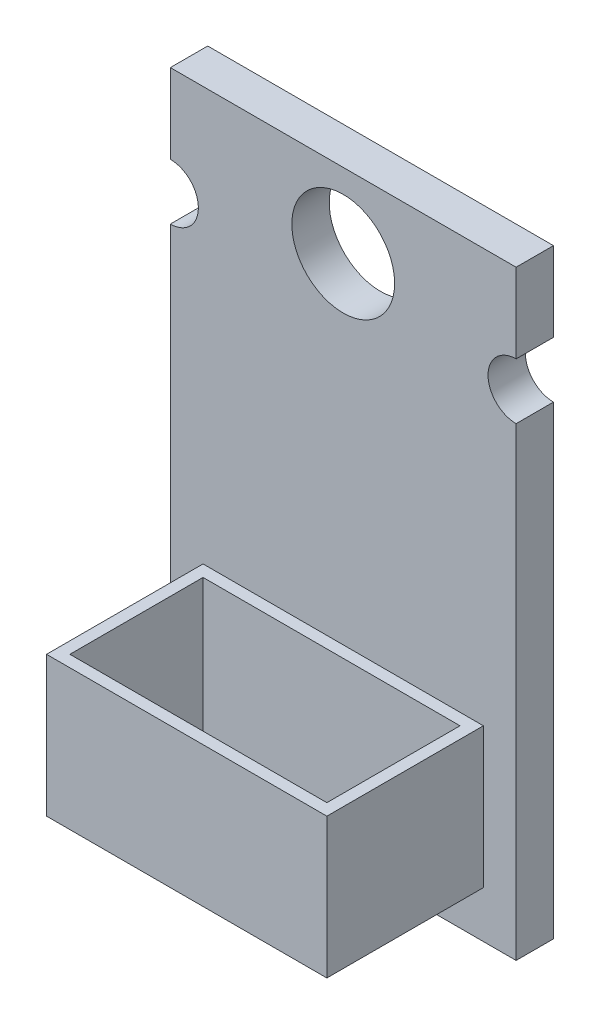
ISO-10303-21;
HEADER;
FILE_DESCRIPTION(('STEP AP214'),'2;1');
FILE_NAME('part.step','',(''),(''),'','','');
FILE_SCHEMA(('AUTOMOTIVE_DESIGN { 1 0 10303 214 1 1 1 1 }'));
ENDSEC;
DATA;
#1=APPLICATION_CONTEXT('core data for automotive mechanical design processes');
#2=APPLICATION_PROTOCOL_DEFINITION('international standard','automotive_design',2000,#1);
#3=PRODUCT_CONTEXT('',#1,'mechanical');
#4=PRODUCT('Part','Part','',(#3));
#5=PRODUCT_RELATED_PRODUCT_CATEGORY('part','',(#4));
#6=PRODUCT_DEFINITION_FORMATION('','',#4);
#7=PRODUCT_DEFINITION_CONTEXT('part definition',#1,'design');
#8=PRODUCT_DEFINITION('design','',#6,#7);
#9=PRODUCT_DEFINITION_SHAPE('','',#8);
#10=(LENGTH_UNIT() NAMED_UNIT(*) SI_UNIT(.MILLI.,.METRE.));
#11=(NAMED_UNIT(*) PLANE_ANGLE_UNIT() SI_UNIT($,.RADIAN.));
#12=(NAMED_UNIT(*) SI_UNIT($,.STERADIAN.) SOLID_ANGLE_UNIT());
#13=UNCERTAINTY_MEASURE_WITH_UNIT(LENGTH_MEASURE(1.E-05),#10,'distance_accuracy_value','');
#14=(GEOMETRIC_REPRESENTATION_CONTEXT(3) GLOBAL_UNCERTAINTY_ASSIGNED_CONTEXT((#13)) GLOBAL_UNIT_ASSIGNED_CONTEXT((#10,
#11,#12)) REPRESENTATION_CONTEXT('',''));
#15=CARTESIAN_POINT('',(0.,0.,0.));
#16=DIRECTION('',(0.,0.,1.));
#17=DIRECTION('',(1.,0.,0.));
#18=AXIS2_PLACEMENT_3D('',#15,#16,#17);
#19=CARTESIAN_POINT('',(-7.4,8.25,1.6));
#20=DIRECTION('',(0.,0.,1.));
#21=DIRECTION('',(1.,0.,0.));
#22=AXIS2_PLACEMENT_3D('',#19,#20,#21);
#23=PLANE('',#22);
#24=DIRECTION('',(0.,-1.,0.));
#25=VECTOR('',#24,1.);
#26=CARTESIAN_POINT('',(-7.4,12.85,1.6));
#27=LINE('',#26,#25);
#28=CARTESIAN_POINT('',(-7.4,12.85,1.6));
#29=VERTEX_POINT('',#28);
#30=CARTESIAN_POINT('',(-7.4,9.45,1.6));
#31=VERTEX_POINT('',#30);
#32=EDGE_CURVE('E256',#29,#31,#27,.T.);
#33=ORIENTED_EDGE('',*,*,#32,.T.);
#34=CARTESIAN_POINT('',(-7.4,8.25,1.6));
#35=DIRECTION('',(0.,0.,-1.));
#36=DIRECTION('',(1.,0.,0.));
#37=AXIS2_PLACEMENT_3D('',#34,#35,#36);
#38=CIRCLE('',#37,1.2);
#39=CARTESIAN_POINT('',(-7.4,7.05,1.6));
#40=VERTEX_POINT('',#39);
#41=EDGE_CURVE('E260',#31,#40,#38,.T.);
#42=ORIENTED_EDGE('',*,*,#41,.T.);
#43=DIRECTION('',(0.,-1.,0.));
#44=VECTOR('',#43,1.);
#45=CARTESIAN_POINT('',(-7.4,-12.85,1.6));
#46=LINE('',#45,#44);
#47=CARTESIAN_POINT('',(-7.4,-12.85,1.6));
#48=VERTEX_POINT('',#47);
#49=EDGE_CURVE('E264',#40,#48,#46,.T.);
#50=ORIENTED_EDGE('',*,*,#49,.T.);
#51=DIRECTION('',(1.,0.,0.));
#52=VECTOR('',#51,1.);
#53=CARTESIAN_POINT('',(7.4,-12.85,1.6));
#54=LINE('',#53,#52);
#55=CARTESIAN_POINT('',(7.4,-12.85,1.6));
#56=VERTEX_POINT('',#55);
#57=EDGE_CURVE('E267',#48,#56,#54,.T.);
#58=ORIENTED_EDGE('',*,*,#57,.T.);
#59=DIRECTION('',(0.,1.,0.));
#60=VECTOR('',#59,1.);
#61=CARTESIAN_POINT('',(7.4,-12.85,1.6));
#62=LINE('',#61,#60);
#63=CARTESIAN_POINT('',(7.4,7.05000000000001,1.6));
#64=VERTEX_POINT('',#63);
#65=EDGE_CURVE('E270',#56,#64,#62,.T.);
#66=ORIENTED_EDGE('',*,*,#65,.T.);
#67=CARTESIAN_POINT('',(7.4,8.25000000000001,1.6));
#68=DIRECTION('',(0.,0.,-1.));
#69=DIRECTION('',(-1.,0.,0.));
#70=AXIS2_PLACEMENT_3D('',#67,#68,#69);
#71=CIRCLE('',#70,1.2);
#72=CARTESIAN_POINT('',(7.4,9.45,1.6));
#73=VERTEX_POINT('',#72);
#74=EDGE_CURVE('E273',#64,#73,#71,.T.);
#75=ORIENTED_EDGE('',*,*,#74,.T.);
#76=DIRECTION('',(0.,1.,0.));
#77=VECTOR('',#76,1.);
#78=CARTESIAN_POINT('',(7.4,9.45,1.6));
#79=LINE('',#78,#77);
#80=CARTESIAN_POINT('',(7.4,12.85,1.6));
#81=VERTEX_POINT('',#80);
#82=EDGE_CURVE('E276',#73,#81,#79,.T.);
#83=ORIENTED_EDGE('',*,*,#82,.T.);
#84=DIRECTION('',(-1.,0.,0.));
#85=VECTOR('',#84,1.);
#86=CARTESIAN_POINT('',(7.4,12.85,1.6));
#87=LINE('',#86,#85);
#88=EDGE_CURVE('E279',#81,#29,#87,.T.);
#89=ORIENTED_EDGE('',*,*,#88,.T.);
#90=EDGE_LOOP('',(#33,#42,#50,#58,#66,#75,#83,#89));
#91=FACE_BOUND('',#90,.T.);
#92=CARTESIAN_POINT('',(0.,9.65000000000001,1.6));
#93=DIRECTION('',(0.,0.,1.));
#94=DIRECTION('',(1.,0.,0.));
#95=AXIS2_PLACEMENT_3D('',#92,#93,#94);
#96=CIRCLE('',#95,2.2);
#97=CARTESIAN_POINT('',(2.2,9.65000000000001,1.6));
#98=VERTEX_POINT('',#97);
#99=EDGE_CURVE('E248',#98,#98,#96,.T.);
#100=ORIENTED_EDGE('',*,*,#99,.F.);
#101=EDGE_LOOP('',(#100));
#102=FACE_BOUND('',#101,.T.);
#103=DIRECTION('',(0.,-1.,0.));
#104=VECTOR('',#103,1.);
#105=CARTESIAN_POINT('',(-5.99999999997181,-4.85,1.59999999999529));
#106=LINE('',#105,#104);
#107=CARTESIAN_POINT('',(-5.99999999997181,-4.85,1.6));
#108=VERTEX_POINT('',#107);
#109=CARTESIAN_POINT('',(-5.99999999997181,-10.85,1.6));
#110=VERTEX_POINT('',#109);
#111=EDGE_CURVE('E60',#108,#110,#106,.T.);
#112=ORIENTED_EDGE('',*,*,#111,.F.);
#113=DIRECTION('',(1.,0.,0.));
#114=VECTOR('',#113,1.);
#115=CARTESIAN_POINT('',(400000.,-4.84999999991475,1.60000000005311));
#116=LINE('',#115,#114);
#117=CARTESIAN_POINT('',(5.99999999997181,-4.85,1.6));
#118=VERTEX_POINT('',#117);
#119=EDGE_CURVE('E55',#108,#118,#116,.T.);
#120=ORIENTED_EDGE('',*,*,#119,.T.);
#121=DIRECTION('',(0.,-1.,0.));
#122=VECTOR('',#121,1.);
#123=CARTESIAN_POINT('',(5.9999999999718,-4.85,1.59999999999627));
#124=LINE('',#123,#122);
#125=CARTESIAN_POINT('',(5.99999999997181,-10.85,1.59999999999627));
#126=VERTEX_POINT('',#125);
#127=EDGE_CURVE('E241',#118,#126,#124,.T.);
#128=ORIENTED_EDGE('',*,*,#127,.T.);
#129=DIRECTION('',(1.,0.,0.));
#130=VECTOR('',#129,1.);
#131=CARTESIAN_POINT('',(400000.,-10.8499999999148,1.60000000005311));
#132=LINE('',#131,#130);
#133=EDGE_CURVE('E230',#110,#126,#132,.T.);
#134=ORIENTED_EDGE('',*,*,#133,.F.);
#135=EDGE_LOOP('',(#112,#120,#128,#134));
#136=FACE_BOUND('',#135,.T.);
#137=ADVANCED_FACE('F39',(#91,#102,#136),#23,.T.);
#138=CARTESIAN_POINT('',(-7.4,8.25,0.));
#139=DIRECTION('',(0.,0.,1.));
#140=DIRECTION('',(1.,0.,0.));
#141=AXIS2_PLACEMENT_3D('',#138,#139,#140);
#142=PLANE('',#141);
#143=DIRECTION('',(0.,-1.,0.));
#144=VECTOR('',#143,1.);
#145=CARTESIAN_POINT('',(-7.4,12.85,0.));
#146=LINE('',#145,#144);
#147=CARTESIAN_POINT('',(-7.4,12.85,0.));
#148=VERTEX_POINT('',#147);
#149=CARTESIAN_POINT('',(-7.4,9.45,0.));
#150=VERTEX_POINT('',#149);
#151=EDGE_CURVE('E252',#148,#150,#146,.T.);
#152=ORIENTED_EDGE('',*,*,#151,.F.);
#153=DIRECTION('',(-1.,0.,0.));
#154=VECTOR('',#153,1.);
#155=CARTESIAN_POINT('',(7.4,12.85,0.));
#156=LINE('',#155,#154);
#157=CARTESIAN_POINT('',(7.4,12.85,0.));
#158=VERTEX_POINT('',#157);
#159=EDGE_CURVE('E261',#158,#148,#156,.T.);
#160=ORIENTED_EDGE('',*,*,#159,.F.);
#161=DIRECTION('',(0.,1.,0.));
#162=VECTOR('',#161,1.);
#163=CARTESIAN_POINT('',(7.4,9.45,0.));
#164=LINE('',#163,#162);
#165=CARTESIAN_POINT('',(7.4,9.45,0.));
#166=VERTEX_POINT('',#165);
#167=EDGE_CURVE('E301',#166,#158,#164,.T.);
#168=ORIENTED_EDGE('',*,*,#167,.F.);
#169=CARTESIAN_POINT('',(7.4,8.25000000000001,0.));
#170=DIRECTION('',(0.,0.,-1.));
#171=DIRECTION('',(-1.,0.,0.));
#172=AXIS2_PLACEMENT_3D('',#169,#170,#171);
#173=CIRCLE('',#172,1.2);
#174=CARTESIAN_POINT('',(7.4,7.05000000000001,0.));
#175=VERTEX_POINT('',#174);
#176=EDGE_CURVE('E298',#175,#166,#173,.T.);
#177=ORIENTED_EDGE('',*,*,#176,.F.);
#178=DIRECTION('',(0.,1.,0.));
#179=VECTOR('',#178,1.);
#180=CARTESIAN_POINT('',(7.4,-12.85,0.));
#181=LINE('',#180,#179);
#182=CARTESIAN_POINT('',(7.4,-12.85,0.));
#183=VERTEX_POINT('',#182);
#184=EDGE_CURVE('E295',#183,#175,#181,.T.);
#185=ORIENTED_EDGE('',*,*,#184,.F.);
#186=DIRECTION('',(1.,0.,0.));
#187=VECTOR('',#186,1.);
#188=CARTESIAN_POINT('',(7.4,-12.85,0.));
#189=LINE('',#188,#187);
#190=CARTESIAN_POINT('',(-7.4,-12.85,0.));
#191=VERTEX_POINT('',#190);
#192=EDGE_CURVE('E292',#191,#183,#189,.T.);
#193=ORIENTED_EDGE('',*,*,#192,.F.);
#194=DIRECTION('',(0.,-1.,0.));
#195=VECTOR('',#194,1.);
#196=CARTESIAN_POINT('',(-7.4,-12.85,0.));
#197=LINE('',#196,#195);
#198=CARTESIAN_POINT('',(-7.4,7.05,0.));
#199=VERTEX_POINT('',#198);
#200=EDGE_CURVE('E289',#199,#191,#197,.T.);
#201=ORIENTED_EDGE('',*,*,#200,.F.);
#202=CARTESIAN_POINT('',(-7.4,8.25,0.));
#203=DIRECTION('',(0.,0.,-1.));
#204=DIRECTION('',(1.,0.,0.));
#205=AXIS2_PLACEMENT_3D('',#202,#203,#204);
#206=CIRCLE('',#205,1.2);
#207=EDGE_CURVE('E286',#150,#199,#206,.T.);
#208=ORIENTED_EDGE('',*,*,#207,.F.);
#209=EDGE_LOOP('',(#152,#160,#168,#177,#185,#193,#201,#208));
#210=FACE_BOUND('',#209,.T.);
#211=CARTESIAN_POINT('',(0.,9.65000000000001,0.));
#212=DIRECTION('',(0.,0.,1.));
#213=DIRECTION('',(1.,0.,0.));
#214=AXIS2_PLACEMENT_3D('',#211,#212,#213);
#215=CIRCLE('',#214,2.2);
#216=CARTESIAN_POINT('',(2.2,9.65000000000001,0.));
#217=VERTEX_POINT('',#216);
#218=EDGE_CURVE('E240',#217,#217,#215,.T.);
#219=ORIENTED_EDGE('',*,*,#218,.T.);
#220=EDGE_LOOP('',(#219));
#221=FACE_BOUND('',#220,.T.);
#222=ADVANCED_FACE('F340',(#210,#221),#142,.F.);
#223=CARTESIAN_POINT('',(-7.4,12.85,1.6));
#224=DIRECTION('',(1.,0.,0.));
#225=DIRECTION('',(0.,0.,-1.));
#226=AXIS2_PLACEMENT_3D('',#223,#224,#225);
#227=PLANE('',#226);
#228=ORIENTED_EDGE('',*,*,#151,.T.);
#229=DIRECTION('',(0.,0.,-1.));
#230=VECTOR('',#229,1.);
#231=CARTESIAN_POINT('',(-7.4,9.45,1.6));
#232=LINE('',#231,#230);
#233=EDGE_CURVE('E11',#31,#150,#232,.T.);
#234=ORIENTED_EDGE('',*,*,#233,.F.);
#235=ORIENTED_EDGE('',*,*,#32,.F.);
#236=DIRECTION('',(0.,0.,-1.));
#237=VECTOR('',#236,1.);
#238=CARTESIAN_POINT('',(-7.4,12.85,1.6));
#239=LINE('',#238,#237);
#240=EDGE_CURVE('E282',#29,#148,#239,.T.);
#241=ORIENTED_EDGE('',*,*,#240,.T.);
#242=EDGE_LOOP('',(#228,#234,#235,#241));
#243=FACE_BOUND('',#242,.T.);
#244=ADVANCED_FACE('F41',(#243),#227,.F.);
#245=CARTESIAN_POINT('',(-7.4,8.25,1.6));
#246=DIRECTION('',(0.,0.,-1.));
#247=DIRECTION('',(-1.,0.,0.));
#248=AXIS2_PLACEMENT_3D('',#245,#246,#247);
#249=CYLINDRICAL_SURFACE('',#248,1.2);
#250=ORIENTED_EDGE('',*,*,#207,.T.);
#251=DIRECTION('',(0.,0.,-1.));
#252=VECTOR('',#251,1.);
#253=CARTESIAN_POINT('',(-7.4,7.05,1.6));
#254=LINE('',#253,#252);
#255=EDGE_CURVE('E48',#40,#199,#254,.T.);
#256=ORIENTED_EDGE('',*,*,#255,.F.);
#257=ORIENTED_EDGE('',*,*,#41,.F.);
#258=ORIENTED_EDGE('',*,*,#233,.T.);
#259=EDGE_LOOP('',(#250,#256,#257,#258));
#260=FACE_BOUND('',#259,.T.);
#261=ADVANCED_FACE('F358',(#260),#249,.F.);
#262=CARTESIAN_POINT('',(-7.4,-12.85,1.6));
#263=DIRECTION('',(1.,0.,0.));
#264=DIRECTION('',(0.,0.,-1.));
#265=AXIS2_PLACEMENT_3D('',#262,#263,#264);
#266=PLANE('',#265);
#267=ORIENTED_EDGE('',*,*,#200,.T.);
#268=DIRECTION('',(0.,0.,-1.));
#269=VECTOR('',#268,1.);
#270=CARTESIAN_POINT('',(-7.4,-12.85,1.6));
#271=LINE('',#270,#269);
#272=EDGE_CURVE('E325',#48,#191,#271,.T.);
#273=ORIENTED_EDGE('',*,*,#272,.F.);
#274=ORIENTED_EDGE('',*,*,#49,.F.);
#275=ORIENTED_EDGE('',*,*,#255,.T.);
#276=EDGE_LOOP('',(#267,#273,#274,#275));
#277=FACE_BOUND('',#276,.T.);
#278=ADVANCED_FACE('F334',(#277),#266,.F.);
#279=CARTESIAN_POINT('',(7.4,-12.85,1.6));
#280=DIRECTION('',(0.,1.,0.));
#281=DIRECTION('',(-1.,0.,0.));
#282=AXIS2_PLACEMENT_3D('',#279,#280,#281);
#283=PLANE('',#282);
#284=ORIENTED_EDGE('',*,*,#192,.T.);
#285=DIRECTION('',(0.,0.,-1.));
#286=VECTOR('',#285,1.);
#287=CARTESIAN_POINT('',(7.4,-12.85,1.6));
#288=LINE('',#287,#286);
#289=EDGE_CURVE('E321',#56,#183,#288,.T.);
#290=ORIENTED_EDGE('',*,*,#289,.F.);
#291=ORIENTED_EDGE('',*,*,#57,.F.);
#292=ORIENTED_EDGE('',*,*,#272,.T.);
#293=EDGE_LOOP('',(#284,#290,#291,#292));
#294=FACE_BOUND('',#293,.T.);
#295=ADVANCED_FACE('F346',(#294),#283,.F.);
#296=CARTESIAN_POINT('',(7.4,-12.85,1.6));
#297=DIRECTION('',(-1.,0.,0.));
#298=DIRECTION('',(0.,0.,1.));
#299=AXIS2_PLACEMENT_3D('',#296,#297,#298);
#300=PLANE('',#299);
#301=ORIENTED_EDGE('',*,*,#184,.T.);
#302=DIRECTION('',(0.,0.,-1.));
#303=VECTOR('',#302,1.);
#304=CARTESIAN_POINT('',(7.4,7.05000000000001,1.6));
#305=LINE('',#304,#303);
#306=EDGE_CURVE('E317',#64,#175,#305,.T.);
#307=ORIENTED_EDGE('',*,*,#306,.F.);
#308=ORIENTED_EDGE('',*,*,#65,.F.);
#309=ORIENTED_EDGE('',*,*,#289,.T.);
#310=EDGE_LOOP('',(#301,#307,#308,#309));
#311=FACE_BOUND('',#310,.T.);
#312=ADVANCED_FACE('F350',(#311),#300,.F.);
#313=CARTESIAN_POINT('',(7.4,8.25000000000001,1.6));
#314=DIRECTION('',(0.,0.,-1.));
#315=DIRECTION('',(-1.,0.,0.));
#316=AXIS2_PLACEMENT_3D('',#313,#314,#315);
#317=CYLINDRICAL_SURFACE('',#316,1.2);
#318=ORIENTED_EDGE('',*,*,#176,.T.);
#319=DIRECTION('',(0.,0.,-1.));
#320=VECTOR('',#319,1.);
#321=CARTESIAN_POINT('',(7.4,9.45,1.6));
#322=LINE('',#321,#320);
#323=EDGE_CURVE('E313',#73,#166,#322,.T.);
#324=ORIENTED_EDGE('',*,*,#323,.F.);
#325=ORIENTED_EDGE('',*,*,#74,.F.);
#326=ORIENTED_EDGE('',*,*,#306,.T.);
#327=EDGE_LOOP('',(#318,#324,#325,#326));
#328=FACE_BOUND('',#327,.T.);
#329=ADVANCED_FACE('F371',(#328),#317,.F.);
#330=CARTESIAN_POINT('',(7.4,9.45,1.6));
#331=DIRECTION('',(-1.,0.,0.));
#332=DIRECTION('',(0.,0.,1.));
#333=AXIS2_PLACEMENT_3D('',#330,#331,#332);
#334=PLANE('',#333);
#335=ORIENTED_EDGE('',*,*,#167,.T.);
#336=DIRECTION('',(0.,0.,-1.));
#337=VECTOR('',#336,1.);
#338=CARTESIAN_POINT('',(7.4,12.85,1.6));
#339=LINE('',#338,#337);
#340=EDGE_CURVE('E309',#81,#158,#339,.T.);
#341=ORIENTED_EDGE('',*,*,#340,.F.);
#342=ORIENTED_EDGE('',*,*,#82,.F.);
#343=ORIENTED_EDGE('',*,*,#323,.T.);
#344=EDGE_LOOP('',(#335,#341,#342,#343));
#345=FACE_BOUND('',#344,.T.);
#346=ADVANCED_FACE('F369',(#345),#334,.F.);
#347=CARTESIAN_POINT('',(7.4,12.85,1.6));
#348=DIRECTION('',(0.,-1.,0.));
#349=DIRECTION('',(1.,0.,0.));
#350=AXIS2_PLACEMENT_3D('',#347,#348,#349);
#351=PLANE('',#350);
#352=ORIENTED_EDGE('',*,*,#159,.T.);
#353=ORIENTED_EDGE('',*,*,#240,.F.);
#354=ORIENTED_EDGE('',*,*,#88,.F.);
#355=ORIENTED_EDGE('',*,*,#340,.T.);
#356=EDGE_LOOP('',(#352,#353,#354,#355));
#357=FACE_BOUND('',#356,.T.);
#358=ADVANCED_FACE('F364',(#357),#351,.F.);
#359=CARTESIAN_POINT('',(0.,9.65000000000001,1.6));
#360=DIRECTION('',(0.,0.,-1.));
#361=DIRECTION('',(-1.,0.,0.));
#362=AXIS2_PLACEMENT_3D('',#359,#360,#361);
#363=CYLINDRICAL_SURFACE('',#362,2.2);
#364=ORIENTED_EDGE('',*,*,#99,.T.);
#365=EDGE_LOOP('',(#364));
#366=FACE_BOUND('',#365,.T.);
#367=ORIENTED_EDGE('',*,*,#218,.F.);
#368=EDGE_LOOP('',(#367));
#369=FACE_BOUND('',#368,.T.);
#370=ADVANCED_FACE('F387',(#366,#369),#363,.F.);
#371=CARTESIAN_POINT('',(400000.,-4.84999999991475,8.30000000007658));
#372=DIRECTION('',(0.,0.,1.));
#373=DIRECTION('',(1.,0.,0.));
#374=AXIS2_PLACEMENT_3D('',#371,#372,#373);
#375=PLANE('',#374);
#376=DIRECTION('',(-1.,0.,0.));
#377=VECTOR('',#376,1.);
#378=CARTESIAN_POINT('',(400000.,-10.8499999999148,8.30000000007658));
#379=LINE('',#378,#377);
#380=CARTESIAN_POINT('',(5.99999999997181,-10.85,8.30000000001974));
#381=VERTEX_POINT('',#380);
#382=CARTESIAN_POINT('',(-5.99999999997181,-10.85,8.30000000001974));
#383=VERTEX_POINT('',#382);
#384=EDGE_CURVE('E201',#381,#383,#379,.T.);
#385=ORIENTED_EDGE('',*,*,#384,.F.);
#386=DIRECTION('',(0.,-1.,0.));
#387=VECTOR('',#386,1.);
#388=CARTESIAN_POINT('',(5.9999999999718,-4.85,8.30000000001974));
#389=LINE('',#388,#387);
#390=CARTESIAN_POINT('',(5.9999999999718,-4.85,8.30000000001974));
#391=VERTEX_POINT('',#390);
#392=EDGE_CURVE('E237',#391,#381,#389,.T.);
#393=ORIENTED_EDGE('',*,*,#392,.F.);
#394=DIRECTION('',(-1.,0.,0.));
#395=VECTOR('',#394,1.);
#396=CARTESIAN_POINT('',(400000.,-4.84999999991475,8.30000000007658));
#397=LINE('',#396,#395);
#398=CARTESIAN_POINT('',(-5.99999999997181,-4.85,8.30000000001974));
#399=VERTEX_POINT('',#398);
#400=EDGE_CURVE('E207',#391,#399,#397,.T.);
#401=ORIENTED_EDGE('',*,*,#400,.T.);
#402=DIRECTION('',(0.,-1.,0.));
#403=VECTOR('',#402,1.);
#404=CARTESIAN_POINT('',(-5.99999999997181,-4.85,8.30000000001974));
#405=LINE('',#404,#403);
#406=EDGE_CURVE('E222',#399,#383,#405,.T.);
#407=ORIENTED_EDGE('',*,*,#406,.T.);
#408=EDGE_LOOP('',(#385,#393,#401,#407));
#409=FACE_BOUND('',#408,.T.);
#410=ADVANCED_FACE('F394',(#409),#375,.T.);
#411=CARTESIAN_POINT('',(5.9999999999718,-4.85,291599.92));
#412=DIRECTION('',(1.,0.,0.));
#413=DIRECTION('',(0.,1.,0.));
#414=AXIS2_PLACEMENT_3D('',#411,#412,#413);
#415=PLANE('',#414);
#416=DIRECTION('',(0.,0.,1.));
#417=VECTOR('',#416,1.);
#418=CARTESIAN_POINT('',(5.99999999997181,-10.85,291599.92));
#419=LINE('',#418,#417);
#420=EDGE_CURVE('E212',#126,#381,#419,.T.);
#421=ORIENTED_EDGE('',*,*,#420,.F.);
#422=ORIENTED_EDGE('',*,*,#127,.F.);
#423=DIRECTION('',(0.,0.,1.));
#424=VECTOR('',#423,1.);
#425=CARTESIAN_POINT('',(5.9999999999718,-4.85,291599.92));
#426=LINE('',#425,#424);
#427=EDGE_CURVE('E218',#118,#391,#426,.T.);
#428=ORIENTED_EDGE('',*,*,#427,.T.);
#429=ORIENTED_EDGE('',*,*,#392,.T.);
#430=EDGE_LOOP('',(#421,#422,#428,#429));
#431=FACE_BOUND('',#430,.T.);
#432=ADVANCED_FACE('F399',(#431),#415,.T.);
#433=CARTESIAN_POINT('',(-5.99999999997181,-4.85,291599.92));
#434=DIRECTION('',(-1.,0.,0.));
#435=DIRECTION('',(0.,-1.,0.));
#436=AXIS2_PLACEMENT_3D('',#433,#434,#435);
#437=PLANE('',#436);
#438=DIRECTION('',(0.,0.,-1.));
#439=VECTOR('',#438,1.);
#440=CARTESIAN_POINT('',(-5.99999999997181,-10.85,291599.92));
#441=LINE('',#440,#439);
#442=EDGE_CURVE('E226',#383,#110,#441,.T.);
#443=ORIENTED_EDGE('',*,*,#442,.F.);
#444=ORIENTED_EDGE('',*,*,#406,.F.);
#445=DIRECTION('',(0.,0.,-1.));
#446=VECTOR('',#445,1.);
#447=CARTESIAN_POINT('',(-5.99999999997181,-4.85,291599.92));
#448=LINE('',#447,#446);
#449=EDGE_CURVE('E211',#399,#108,#448,.T.);
#450=ORIENTED_EDGE('',*,*,#449,.T.);
#451=ORIENTED_EDGE('',*,*,#111,.T.);
#452=EDGE_LOOP('',(#443,#444,#450,#451));
#453=FACE_BOUND('',#452,.T.);
#454=ADVANCED_FACE('F407',(#453),#437,.T.);
#455=CARTESIAN_POINT('',(0.,-4.85,0.));
#456=DIRECTION('',(0.,-1.,0.));
#457=DIRECTION('',(1.,0.,0.));
#458=AXIS2_PLACEMENT_3D('',#455,#456,#457);
#459=PLANE('',#458);
#460=DIRECTION('',(0.,0.,-1.));
#461=VECTOR('',#460,1.);
#462=CARTESIAN_POINT('',(-5.49999999998363,-4.85,291599.92));
#463=LINE('',#462,#461);
#464=CARTESIAN_POINT('',(-5.49999999998363,-4.85,7.79999999997472));
#465=VERTEX_POINT('',#464);
#466=CARTESIAN_POINT('',(-5.49999999998363,-4.85,2.09999999998445));
#467=VERTEX_POINT('',#466);
#468=EDGE_CURVE('E164',#465,#467,#463,.T.);
#469=ORIENTED_EDGE('',*,*,#468,.T.);
#470=DIRECTION('',(1.,0.,0.));
#471=VECTOR('',#470,1.);
#472=CARTESIAN_POINT('',(400000.,-4.84999999991475,2.10000000004129));
#473=LINE('',#472,#471);
#474=CARTESIAN_POINT('',(5.49999999998363,-4.85,2.09999999998445));
#475=VERTEX_POINT('',#474);
#476=EDGE_CURVE('E155',#467,#475,#473,.T.);
#477=ORIENTED_EDGE('',*,*,#476,.T.);
#478=DIRECTION('',(0.,0.,1.));
#479=VECTOR('',#478,1.);
#480=CARTESIAN_POINT('',(5.49999999998363,-4.85,291599.92));
#481=LINE('',#480,#479);
#482=CARTESIAN_POINT('',(5.49999999998363,-4.85,7.79999999997472));
#483=VERTEX_POINT('',#482);
#484=EDGE_CURVE('E168',#475,#483,#481,.T.);
#485=ORIENTED_EDGE('',*,*,#484,.T.);
#486=DIRECTION('',(-1.,0.,0.));
#487=VECTOR('',#486,1.);
#488=CARTESIAN_POINT('',(400000.,-4.84999999991475,7.79999999997472));
#489=LINE('',#488,#487);
#490=EDGE_CURVE('E173',#483,#465,#489,.T.);
#491=ORIENTED_EDGE('',*,*,#490,.T.);
#492=EDGE_LOOP('',(#469,#477,#485,#491));
#493=FACE_BOUND('',#492,.T.);
#494=ORIENTED_EDGE('',*,*,#400,.F.);
#495=ORIENTED_EDGE('',*,*,#427,.F.);
#496=ORIENTED_EDGE('',*,*,#119,.F.);
#497=ORIENTED_EDGE('',*,*,#449,.F.);
#498=EDGE_LOOP('',(#494,#495,#496,#497));
#499=FACE_BOUND('',#498,.T.);
#500=ADVANCED_FACE('F175',(#493,#499),#459,.F.);
#501=CARTESIAN_POINT('',(0.,-10.85,0.));
#502=DIRECTION('',(0.,-1.,0.));
#503=DIRECTION('',(1.,0.,0.));
#504=AXIS2_PLACEMENT_3D('',#501,#502,#503);
#505=PLANE('',#504);
#506=DIRECTION('',(1.,0.,0.));
#507=VECTOR('',#506,1.);
#508=CARTESIAN_POINT('',(400000.,-10.8499999999148,2.10000000004129));
#509=LINE('',#508,#507);
#510=CARTESIAN_POINT('',(-5.49999999998363,-10.85,2.09999999998445));
#511=VERTEX_POINT('',#510);
#512=CARTESIAN_POINT('',(5.49999999998363,-10.85,2.09999999998445));
#513=VERTEX_POINT('',#512);
#514=EDGE_CURVE('E158',#511,#513,#509,.T.);
#515=ORIENTED_EDGE('',*,*,#514,.F.);
#516=DIRECTION('',(0.,0.,-1.));
#517=VECTOR('',#516,1.);
#518=CARTESIAN_POINT('',(-5.49999999998363,-10.85,291599.92));
#519=LINE('',#518,#517);
#520=CARTESIAN_POINT('',(-5.49999999998363,-10.85,7.79999999997472));
#521=VERTEX_POINT('',#520);
#522=EDGE_CURVE('E179',#521,#511,#519,.T.);
#523=ORIENTED_EDGE('',*,*,#522,.F.);
#524=DIRECTION('',(-1.,0.,0.));
#525=VECTOR('',#524,1.);
#526=CARTESIAN_POINT('',(400000.,-10.8499999999148,7.79999999997472));
#527=LINE('',#526,#525);
#528=CARTESIAN_POINT('',(5.49999999998363,-10.85,7.79999999997472));
#529=VERTEX_POINT('',#528);
#530=EDGE_CURVE('E183',#529,#521,#527,.T.);
#531=ORIENTED_EDGE('',*,*,#530,.F.);
#532=DIRECTION('',(0.,0.,1.));
#533=VECTOR('',#532,1.);
#534=CARTESIAN_POINT('',(5.49999999998363,-10.85,291599.92));
#535=LINE('',#534,#533);
#536=EDGE_CURVE('E192',#513,#529,#535,.T.);
#537=ORIENTED_EDGE('',*,*,#536,.F.);
#538=EDGE_LOOP('',(#515,#523,#531,#537));
#539=FACE_BOUND('',#538,.T.);
#540=ORIENTED_EDGE('',*,*,#384,.T.);
#541=ORIENTED_EDGE('',*,*,#442,.T.);
#542=ORIENTED_EDGE('',*,*,#133,.T.);
#543=ORIENTED_EDGE('',*,*,#420,.T.);
#544=EDGE_LOOP('',(#540,#541,#542,#543));
#545=FACE_BOUND('',#544,.T.);
#546=ADVANCED_FACE('F415',(#539,#545),#505,.T.);
#547=CARTESIAN_POINT('',(400000.,-4.84999999991475,2.10000000004129));
#548=DIRECTION('',(0.,0.,-1.));
#549=DIRECTION('',(-1.,0.,0.));
#550=AXIS2_PLACEMENT_3D('',#547,#548,#549);
#551=PLANE('',#550);
#552=ORIENTED_EDGE('',*,*,#514,.T.);
#553=DIRECTION('',(0.,-1.,0.));
#554=VECTOR('',#553,1.);
#555=CARTESIAN_POINT('',(5.49999999998363,-4.85,2.09999999998445));
#556=LINE('',#555,#554);
#557=EDGE_CURVE('E151',#475,#513,#556,.T.);
#558=ORIENTED_EDGE('',*,*,#557,.F.);
#559=ORIENTED_EDGE('',*,*,#476,.F.);
#560=DIRECTION('',(0.,-1.,0.));
#561=VECTOR('',#560,1.);
#562=CARTESIAN_POINT('',(-5.49999999998363,-4.85,2.09999999998445));
#563=LINE('',#562,#561);
#564=EDGE_CURVE('E198',#467,#511,#563,.T.);
#565=ORIENTED_EDGE('',*,*,#564,.T.);
#566=EDGE_LOOP('',(#552,#558,#559,#565));
#567=FACE_BOUND('',#566,.T.);
#568=ADVANCED_FACE('F153',(#567),#551,.F.);
#569=CARTESIAN_POINT('',(-5.49999999998363,-4.85,291599.92));
#570=DIRECTION('',(-1.,0.,0.));
#571=DIRECTION('',(0.,-1.,0.));
#572=AXIS2_PLACEMENT_3D('',#569,#570,#571);
#573=PLANE('',#572);
#574=ORIENTED_EDGE('',*,*,#522,.T.);
#575=ORIENTED_EDGE('',*,*,#564,.F.);
#576=ORIENTED_EDGE('',*,*,#468,.F.);
#577=DIRECTION('',(0.,-1.,0.));
#578=VECTOR('',#577,1.);
#579=CARTESIAN_POINT('',(-5.49999999998363,-4.85,7.79999999997472));
#580=LINE('',#579,#578);
#581=EDGE_CURVE('E202',#465,#521,#580,.T.);
#582=ORIENTED_EDGE('',*,*,#581,.T.);
#583=EDGE_LOOP('',(#574,#575,#576,#582));
#584=FACE_BOUND('',#583,.T.);
#585=ADVANCED_FACE('F423',(#584),#573,.F.);
#586=CARTESIAN_POINT('',(400000.,-4.84999999991475,7.79999999997472));
#587=DIRECTION('',(0.,0.,1.));
#588=DIRECTION('',(1.,0.,0.));
#589=AXIS2_PLACEMENT_3D('',#586,#587,#588);
#590=PLANE('',#589);
#591=ORIENTED_EDGE('',*,*,#530,.T.);
#592=ORIENTED_EDGE('',*,*,#581,.F.);
#593=ORIENTED_EDGE('',*,*,#490,.F.);
#594=DIRECTION('',(0.,-1.,0.));
#595=VECTOR('',#594,1.);
#596=CARTESIAN_POINT('',(5.49999999998363,-4.85,7.79999999997472));
#597=LINE('',#596,#595);
#598=EDGE_CURVE('E163',#483,#529,#597,.T.);
#599=ORIENTED_EDGE('',*,*,#598,.T.);
#600=EDGE_LOOP('',(#591,#592,#593,#599));
#601=FACE_BOUND('',#600,.T.);
#602=ADVANCED_FACE('F426',(#601),#590,.F.);
#603=CARTESIAN_POINT('',(5.49999999998363,-4.85,291599.92));
#604=DIRECTION('',(1.,0.,0.));
#605=DIRECTION('',(0.,1.,0.));
#606=AXIS2_PLACEMENT_3D('',#603,#604,#605);
#607=PLANE('',#606);
#608=ORIENTED_EDGE('',*,*,#536,.T.);
#609=ORIENTED_EDGE('',*,*,#598,.F.);
#610=ORIENTED_EDGE('',*,*,#484,.F.);
#611=ORIENTED_EDGE('',*,*,#557,.T.);
#612=EDGE_LOOP('',(#608,#609,#610,#611));
#613=FACE_BOUND('',#612,.T.);
#614=ADVANCED_FACE('F169',(#613),#607,.F.);
#615=CLOSED_SHELL('',(#137,#222,#244,#261,#278,#295,#312,#329,#346,#358,#370,#410,#432,#454,
#500,#546,#568,#585,#602,#614));
#616=MANIFOLD_SOLID_BREP('B2',#615);
#617=ADVANCED_BREP_SHAPE_REPRESENTATION('',(#18,#616),#14);
#618=SHAPE_DEFINITION_REPRESENTATION(#9,#617);
ENDSEC;
END-ISO-10303-21;
